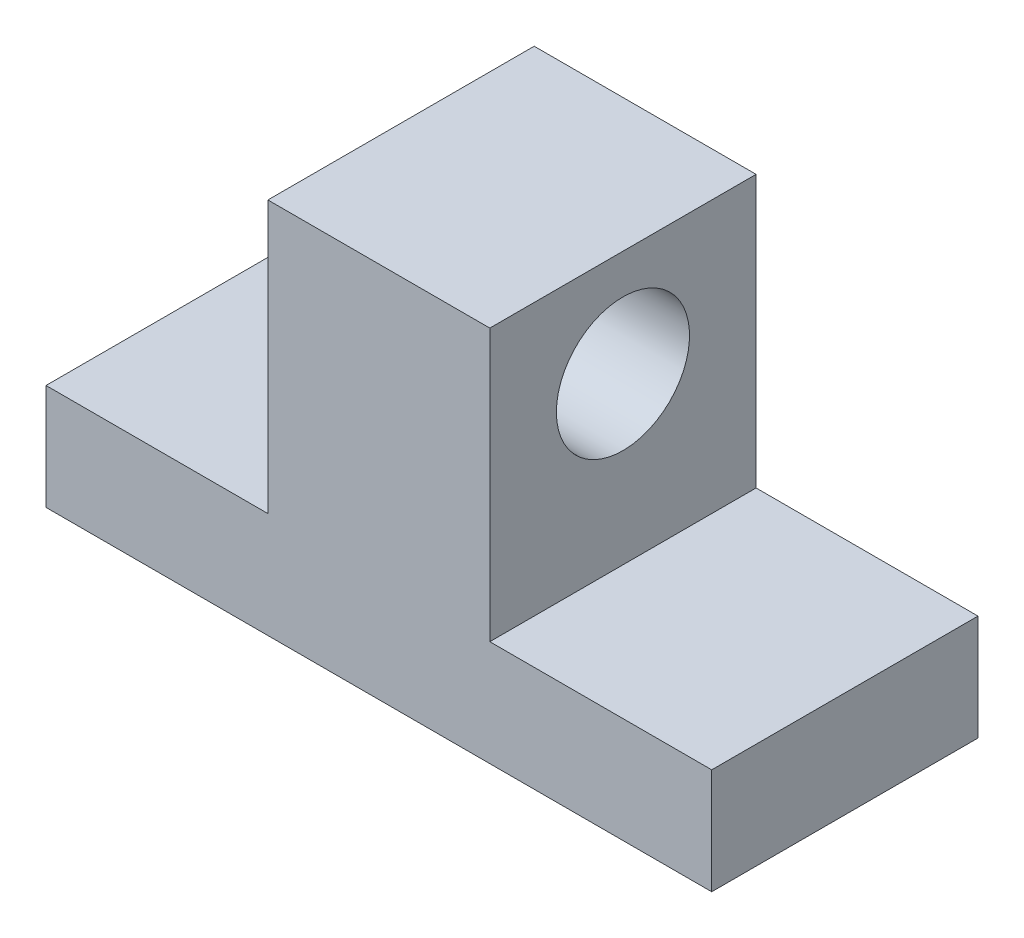
ISO-10303-21;
HEADER;
FILE_DESCRIPTION(('STEP AP214'),'2;1');
FILE_NAME('part.step','',(''),(''),'','','');
FILE_SCHEMA(('AUTOMOTIVE_DESIGN { 1 0 10303 214 1 1 1 1 }'));
ENDSEC;
DATA;
#1=APPLICATION_CONTEXT('core data for automotive mechanical design processes');
#2=APPLICATION_PROTOCOL_DEFINITION('international standard','automotive_design',2000,#1);
#3=PRODUCT_CONTEXT('',#1,'mechanical');
#4=PRODUCT('Part','Part','',(#3));
#5=PRODUCT_RELATED_PRODUCT_CATEGORY('part','',(#4));
#6=PRODUCT_DEFINITION_FORMATION('','',#4);
#7=PRODUCT_DEFINITION_CONTEXT('part definition',#1,'design');
#8=PRODUCT_DEFINITION('design','',#6,#7);
#9=PRODUCT_DEFINITION_SHAPE('','',#8);
#10=(LENGTH_UNIT() NAMED_UNIT(*) SI_UNIT(.MILLI.,.METRE.));
#11=(NAMED_UNIT(*) PLANE_ANGLE_UNIT() SI_UNIT($,.RADIAN.));
#12=(NAMED_UNIT(*) SI_UNIT($,.STERADIAN.) SOLID_ANGLE_UNIT());
#13=UNCERTAINTY_MEASURE_WITH_UNIT(LENGTH_MEASURE(1.E-05),#10,'distance_accuracy_value','');
#14=(GEOMETRIC_REPRESENTATION_CONTEXT(3) GLOBAL_UNCERTAINTY_ASSIGNED_CONTEXT((#13)) GLOBAL_UNIT_ASSIGNED_CONTEXT((#10,
#11,#12)) REPRESENTATION_CONTEXT('',''));
#15=CARTESIAN_POINT('',(0.,0.,0.));
#16=DIRECTION('',(0.,0.,1.));
#17=DIRECTION('',(1.,0.,0.));
#18=AXIS2_PLACEMENT_3D('',#15,#16,#17);
#19=CARTESIAN_POINT('',(0.846446280991737,4.76010881228939,12.));
#20=DIRECTION('',(-1.,0.,0.));
#21=DIRECTION('',(0.,0.,1.));
#22=AXIS2_PLACEMENT_3D('',#19,#20,#21);
#23=PLANE('',#22);
#24=DIRECTION('',(0.,1.,0.));
#25=VECTOR('',#24,1.);
#26=CARTESIAN_POINT('',(0.846446280991737,4.76010881228939,0.));
#27=LINE('',#26,#25);
#28=CARTESIAN_POINT('',(0.846446280991737,0.,0.));
#29=VERTEX_POINT('',#28);
#30=CARTESIAN_POINT('',(0.846446280991737,4.76010881228939,0.));
#31=VERTEX_POINT('',#30);
#32=EDGE_CURVE('E129',#29,#31,#27,.T.);
#33=ORIENTED_EDGE('',*,*,#32,.T.);
#34=DIRECTION('',(0.,0.,-1.));
#35=VECTOR('',#34,1.);
#36=CARTESIAN_POINT('',(0.846446280991737,4.76010881228939,12.));
#37=LINE('',#36,#35);
#38=CARTESIAN_POINT('',(0.846446280991737,4.76010881228939,12.));
#39=VERTEX_POINT('',#38);
#40=EDGE_CURVE('E11',#39,#31,#37,.T.);
#41=ORIENTED_EDGE('',*,*,#40,.F.);
#42=DIRECTION('',(0.,1.,0.));
#43=VECTOR('',#42,1.);
#44=CARTESIAN_POINT('',(0.846446280991737,4.76010881228939,12.));
#45=LINE('',#44,#43);
#46=CARTESIAN_POINT('',(0.846446280991737,0.,12.));
#47=VERTEX_POINT('',#46);
#48=EDGE_CURVE('E144',#47,#39,#45,.T.);
#49=ORIENTED_EDGE('',*,*,#48,.F.);
#50=DIRECTION('',(0.,0.,-1.));
#51=VECTOR('',#50,1.);
#52=CARTESIAN_POINT('',(0.846446280991737,0.,12.));
#53=LINE('',#52,#51);
#54=EDGE_CURVE('E125',#47,#29,#53,.T.);
#55=ORIENTED_EDGE('',*,*,#54,.T.);
#56=EDGE_LOOP('',(#33,#41,#49,#55));
#57=FACE_BOUND('',#56,.T.);
#58=ADVANCED_FACE('F33',(#57),#23,.F.);
#59=CARTESIAN_POINT('',(0.846446280991737,4.76010881228939,12.));
#60=DIRECTION('',(0.,-1.,0.));
#61=DIRECTION('',(0.,0.,-1.));
#62=AXIS2_PLACEMENT_3D('',#59,#60,#61);
#63=PLANE('',#62);
#64=DIRECTION('',(-1.,0.,0.));
#65=VECTOR('',#64,1.);
#66=CARTESIAN_POINT('',(0.846446280991737,4.76010881228939,0.));
#67=LINE('',#66,#65);
#68=CARTESIAN_POINT('',(-9.15355371900826,4.76010881228939,0.));
#69=VERTEX_POINT('',#68);
#70=EDGE_CURVE('E132',#31,#69,#67,.T.);
#71=ORIENTED_EDGE('',*,*,#70,.T.);
#72=DIRECTION('',(0.,0.,-1.));
#73=VECTOR('',#72,1.);
#74=CARTESIAN_POINT('',(-9.15355371900826,4.76010881228939,12.));
#75=LINE('',#74,#73);
#76=CARTESIAN_POINT('',(-9.15355371900826,4.76010881228939,12.));
#77=VERTEX_POINT('',#76);
#78=EDGE_CURVE('E41',#77,#69,#75,.T.);
#79=ORIENTED_EDGE('',*,*,#78,.F.);
#80=DIRECTION('',(-1.,0.,0.));
#81=VECTOR('',#80,1.);
#82=CARTESIAN_POINT('',(0.846446280991737,4.76010881228939,12.));
#83=LINE('',#82,#81);
#84=EDGE_CURVE('E92',#39,#77,#83,.T.);
#85=ORIENTED_EDGE('',*,*,#84,.F.);
#86=ORIENTED_EDGE('',*,*,#40,.T.);
#87=EDGE_LOOP('',(#71,#79,#85,#86));
#88=FACE_BOUND('',#87,.T.);
#89=ADVANCED_FACE('F195',(#88),#63,.F.);
#90=CARTESIAN_POINT('',(-9.15355371900826,4.76010881228939,12.));
#91=DIRECTION('',(-1.,0.,0.));
#92=DIRECTION('',(0.,0.,1.));
#93=AXIS2_PLACEMENT_3D('',#90,#91,#92);
#94=PLANE('',#93);
#95=CARTESIAN_POINT('',(-9.15355371900826,12.2170210392971,6.));
#96=DIRECTION('',(-1.,0.,0.));
#97=DIRECTION('',(0.,0.,1.));
#98=AXIS2_PLACEMENT_3D('',#95,#96,#97);
#99=CIRCLE('',#98,3.);
#100=CARTESIAN_POINT('',(-9.15355371900826,12.2170210392971,9.));
#101=VERTEX_POINT('',#100);
#102=EDGE_CURVE('E133',#101,#101,#99,.T.);
#103=ORIENTED_EDGE('',*,*,#102,.T.);
#104=EDGE_LOOP('',(#103));
#105=FACE_BOUND('',#104,.T.);
#106=DIRECTION('',(0.,1.,0.));
#107=VECTOR('',#106,1.);
#108=CARTESIAN_POINT('',(-9.15355371900826,4.76010881228939,0.));
#109=LINE('',#108,#107);
#110=CARTESIAN_POINT('',(-9.15355371900826,17.,0.));
#111=VERTEX_POINT('',#110);
#112=EDGE_CURVE('E135',#69,#111,#109,.T.);
#113=ORIENTED_EDGE('',*,*,#112,.T.);
#114=DIRECTION('',(0.,0.,-1.));
#115=VECTOR('',#114,1.);
#116=CARTESIAN_POINT('',(-9.15355371900826,17.,12.));
#117=LINE('',#116,#115);
#118=CARTESIAN_POINT('',(-9.15355371900826,17.,12.));
#119=VERTEX_POINT('',#118);
#120=EDGE_CURVE('E151',#119,#111,#117,.T.);
#121=ORIENTED_EDGE('',*,*,#120,.F.);
#122=DIRECTION('',(0.,1.,0.));
#123=VECTOR('',#122,1.);
#124=CARTESIAN_POINT('',(-9.15355371900826,4.76010881228939,12.));
#125=LINE('',#124,#123);
#126=EDGE_CURVE('E159',#77,#119,#125,.T.);
#127=ORIENTED_EDGE('',*,*,#126,.F.);
#128=ORIENTED_EDGE('',*,*,#78,.T.);
#129=EDGE_LOOP('',(#113,#121,#127,#128));
#130=FACE_BOUND('',#129,.T.);
#131=ADVANCED_FACE('F157',(#105,#130),#94,.F.);
#132=CARTESIAN_POINT('',(-19.1535537190083,17.,12.));
#133=DIRECTION('',(0.,-1.,0.));
#134=DIRECTION('',(0.,0.,-1.));
#135=AXIS2_PLACEMENT_3D('',#132,#133,#134);
#136=PLANE('',#135);
#137=DIRECTION('',(-1.,0.,0.));
#138=VECTOR('',#137,1.);
#139=CARTESIAN_POINT('',(-19.1535537190083,17.,0.));
#140=LINE('',#139,#138);
#141=CARTESIAN_POINT('',(-19.1535537190083,17.,0.));
#142=VERTEX_POINT('',#141);
#143=EDGE_CURVE('E137',#111,#142,#140,.T.);
#144=ORIENTED_EDGE('',*,*,#143,.T.);
#145=DIRECTION('',(0.,0.,-1.));
#146=VECTOR('',#145,1.);
#147=CARTESIAN_POINT('',(-19.1535537190083,17.,12.));
#148=LINE('',#147,#146);
#149=CARTESIAN_POINT('',(-19.1535537190083,17.,12.));
#150=VERTEX_POINT('',#149);
#151=EDGE_CURVE('E148',#150,#142,#148,.T.);
#152=ORIENTED_EDGE('',*,*,#151,.F.);
#153=DIRECTION('',(-1.,0.,0.));
#154=VECTOR('',#153,1.);
#155=CARTESIAN_POINT('',(-19.1535537190083,17.,12.));
#156=LINE('',#155,#154);
#157=EDGE_CURVE('E171',#119,#150,#156,.T.);
#158=ORIENTED_EDGE('',*,*,#157,.F.);
#159=ORIENTED_EDGE('',*,*,#120,.T.);
#160=EDGE_LOOP('',(#144,#152,#158,#159));
#161=FACE_BOUND('',#160,.T.);
#162=ADVANCED_FACE('F167',(#161),#136,.F.);
#163=CARTESIAN_POINT('',(-19.1535537190083,4.76010881228939,12.));
#164=DIRECTION('',(1.,0.,0.));
#165=DIRECTION('',(0.,0.,-1.));
#166=AXIS2_PLACEMENT_3D('',#163,#164,#165);
#167=PLANE('',#166);
#168=CARTESIAN_POINT('',(-19.1535537190083,12.2170210392971,6.));
#169=DIRECTION('',(-1.,0.,0.));
#170=DIRECTION('',(0.,0.,1.));
#171=AXIS2_PLACEMENT_3D('',#168,#169,#170);
#172=CIRCLE('',#171,3.);
#173=CARTESIAN_POINT('',(-19.1535537190083,12.2170210392971,9.));
#174=VERTEX_POINT('',#173);
#175=EDGE_CURVE('E179',#174,#174,#172,.T.);
#176=ORIENTED_EDGE('',*,*,#175,.F.);
#177=EDGE_LOOP('',(#176));
#178=FACE_BOUND('',#177,.T.);
#179=DIRECTION('',(0.,-1.,0.));
#180=VECTOR('',#179,1.);
#181=CARTESIAN_POINT('',(-19.1535537190083,4.76010881228939,0.));
#182=LINE('',#181,#180);
#183=CARTESIAN_POINT('',(-19.1535537190083,4.76010881228939,0.));
#184=VERTEX_POINT('',#183);
#185=EDGE_CURVE('E139',#142,#184,#182,.T.);
#186=ORIENTED_EDGE('',*,*,#185,.T.);
#187=DIRECTION('',(0.,0.,-1.));
#188=VECTOR('',#187,1.);
#189=CARTESIAN_POINT('',(-19.1535537190083,4.76010881228939,12.));
#190=LINE('',#189,#188);
#191=CARTESIAN_POINT('',(-19.1535537190083,4.76010881228939,12.));
#192=VERTEX_POINT('',#191);
#193=EDGE_CURVE('E120',#192,#184,#190,.T.);
#194=ORIENTED_EDGE('',*,*,#193,.F.);
#195=DIRECTION('',(0.,-1.,0.));
#196=VECTOR('',#195,1.);
#197=CARTESIAN_POINT('',(-19.1535537190083,4.76010881228939,12.));
#198=LINE('',#197,#196);
#199=EDGE_CURVE('E111',#150,#192,#198,.T.);
#200=ORIENTED_EDGE('',*,*,#199,.F.);
#201=ORIENTED_EDGE('',*,*,#151,.T.);
#202=EDGE_LOOP('',(#186,#194,#200,#201));
#203=FACE_BOUND('',#202,.T.);
#204=ADVANCED_FACE('F170',(#178,#203),#167,.F.);
#205=CARTESIAN_POINT('',(-29.1535537190083,4.76010881228939,12.));
#206=DIRECTION('',(0.,-1.,0.));
#207=DIRECTION('',(0.,0.,-1.));
#208=AXIS2_PLACEMENT_3D('',#205,#206,#207);
#209=PLANE('',#208);
#210=DIRECTION('',(-1.,0.,0.));
#211=VECTOR('',#210,1.);
#212=CARTESIAN_POINT('',(-29.1535537190083,4.76010881228939,0.));
#213=LINE('',#212,#211);
#214=CARTESIAN_POINT('',(-29.1535537190083,4.76010881228939,0.));
#215=VERTEX_POINT('',#214);
#216=EDGE_CURVE('E119',#184,#215,#213,.T.);
#217=ORIENTED_EDGE('',*,*,#216,.T.);
#218=DIRECTION('',(0.,0.,-1.));
#219=VECTOR('',#218,1.);
#220=CARTESIAN_POINT('',(-29.1535537190083,4.76010881228939,12.));
#221=LINE('',#220,#219);
#222=CARTESIAN_POINT('',(-29.1535537190083,4.76010881228939,12.));
#223=VERTEX_POINT('',#222);
#224=EDGE_CURVE('E116',#223,#215,#221,.T.);
#225=ORIENTED_EDGE('',*,*,#224,.F.);
#226=DIRECTION('',(-1.,0.,0.));
#227=VECTOR('',#226,1.);
#228=CARTESIAN_POINT('',(-29.1535537190083,4.76010881228939,12.));
#229=LINE('',#228,#227);
#230=EDGE_CURVE('E105',#192,#223,#229,.T.);
#231=ORIENTED_EDGE('',*,*,#230,.F.);
#232=ORIENTED_EDGE('',*,*,#193,.T.);
#233=EDGE_LOOP('',(#217,#225,#231,#232));
#234=FACE_BOUND('',#233,.T.);
#235=ADVANCED_FACE('F117',(#234),#209,.F.);
#236=CARTESIAN_POINT('',(-29.1535537190083,4.76010881228939,12.));
#237=DIRECTION('',(1.,0.,0.));
#238=DIRECTION('',(0.,0.,-1.));
#239=AXIS2_PLACEMENT_3D('',#236,#237,#238);
#240=PLANE('',#239);
#241=DIRECTION('',(0.,-1.,0.));
#242=VECTOR('',#241,1.);
#243=CARTESIAN_POINT('',(-29.1535537190083,4.76010881228939,0.));
#244=LINE('',#243,#242);
#245=CARTESIAN_POINT('',(-29.1535537190083,0.,0.));
#246=VERTEX_POINT('',#245);
#247=EDGE_CURVE('E78',#215,#246,#244,.T.);
#248=ORIENTED_EDGE('',*,*,#247,.T.);
#249=DIRECTION('',(0.,0.,-1.));
#250=VECTOR('',#249,1.);
#251=CARTESIAN_POINT('',(-29.1535537190083,0.,12.));
#252=LINE('',#251,#250);
#253=CARTESIAN_POINT('',(-29.1535537190083,0.,12.));
#254=VERTEX_POINT('',#253);
#255=EDGE_CURVE('E121',#254,#246,#252,.T.);
#256=ORIENTED_EDGE('',*,*,#255,.F.);
#257=DIRECTION('',(0.,-1.,0.));
#258=VECTOR('',#257,1.);
#259=CARTESIAN_POINT('',(-29.1535537190083,4.76010881228939,12.));
#260=LINE('',#259,#258);
#261=EDGE_CURVE('E109',#223,#254,#260,.T.);
#262=ORIENTED_EDGE('',*,*,#261,.F.);
#263=ORIENTED_EDGE('',*,*,#224,.T.);
#264=EDGE_LOOP('',(#248,#256,#262,#263));
#265=FACE_BOUND('',#264,.T.);
#266=ADVANCED_FACE('F123',(#265),#240,.F.);
#267=CARTESIAN_POINT('',(0.846446280991737,0.,12.));
#268=DIRECTION('',(0.,1.,0.));
#269=DIRECTION('',(-1.,0.,0.));
#270=AXIS2_PLACEMENT_3D('',#267,#268,#269);
#271=PLANE('',#270);
#272=DIRECTION('',(1.,0.,0.));
#273=VECTOR('',#272,1.);
#274=CARTESIAN_POINT('',(0.846446280991737,0.,0.));
#275=LINE('',#274,#273);
#276=EDGE_CURVE('E84',#246,#29,#275,.T.);
#277=ORIENTED_EDGE('',*,*,#276,.T.);
#278=ORIENTED_EDGE('',*,*,#54,.F.);
#279=DIRECTION('',(1.,0.,0.));
#280=VECTOR('',#279,1.);
#281=CARTESIAN_POINT('',(0.846446280991737,0.,12.));
#282=LINE('',#281,#280);
#283=EDGE_CURVE('E49',#254,#47,#282,.T.);
#284=ORIENTED_EDGE('',*,*,#283,.F.);
#285=ORIENTED_EDGE('',*,*,#255,.T.);
#286=EDGE_LOOP('',(#277,#278,#284,#285));
#287=FACE_BOUND('',#286,.T.);
#288=ADVANCED_FACE('F202',(#287),#271,.F.);
#289=CARTESIAN_POINT('',(0.846446280991737,0.,12.));
#290=DIRECTION('',(0.,0.,-1.));
#291=DIRECTION('',(-1.,0.,0.));
#292=AXIS2_PLACEMENT_3D('',#289,#290,#291);
#293=PLANE('',#292);
#294=ORIENTED_EDGE('',*,*,#48,.T.);
#295=ORIENTED_EDGE('',*,*,#84,.T.);
#296=ORIENTED_EDGE('',*,*,#126,.T.);
#297=ORIENTED_EDGE('',*,*,#157,.T.);
#298=ORIENTED_EDGE('',*,*,#199,.T.);
#299=ORIENTED_EDGE('',*,*,#230,.T.);
#300=ORIENTED_EDGE('',*,*,#261,.T.);
#301=ORIENTED_EDGE('',*,*,#283,.T.);
#302=EDGE_LOOP('',(#294,#295,#296,#297,#298,#299,#300,#301));
#303=FACE_BOUND('',#302,.T.);
#304=ADVANCED_FACE('F107',(#303),#293,.F.);
#305=CARTESIAN_POINT('',(0.846446280991737,0.,0.));
#306=DIRECTION('',(0.,0.,-1.));
#307=DIRECTION('',(-1.,0.,0.));
#308=AXIS2_PLACEMENT_3D('',#305,#306,#307);
#309=PLANE('',#308);
#310=ORIENTED_EDGE('',*,*,#32,.F.);
#311=ORIENTED_EDGE('',*,*,#276,.F.);
#312=ORIENTED_EDGE('',*,*,#247,.F.);
#313=ORIENTED_EDGE('',*,*,#216,.F.);
#314=ORIENTED_EDGE('',*,*,#185,.F.);
#315=ORIENTED_EDGE('',*,*,#143,.F.);
#316=ORIENTED_EDGE('',*,*,#112,.F.);
#317=ORIENTED_EDGE('',*,*,#70,.F.);
#318=EDGE_LOOP('',(#310,#311,#312,#313,#314,#315,#316,#317));
#319=FACE_BOUND('',#318,.T.);
#320=ADVANCED_FACE('F163',(#319),#309,.T.);
#321=CARTESIAN_POINT('',(0.846446280991737,12.2170210392971,6.));
#322=DIRECTION('',(-1.,0.,0.));
#323=DIRECTION('',(0.,0.,1.));
#324=AXIS2_PLACEMENT_3D('',#321,#322,#323);
#325=CYLINDRICAL_SURFACE('',#324,3.);
#326=ORIENTED_EDGE('',*,*,#175,.T.);
#327=EDGE_LOOP('',(#326));
#328=FACE_BOUND('',#327,.T.);
#329=ORIENTED_EDGE('',*,*,#102,.F.);
#330=EDGE_LOOP('',(#329));
#331=FACE_BOUND('',#330,.T.);
#332=ADVANCED_FACE('F183',(#328,#331),#325,.F.);
#333=CLOSED_SHELL('',(#58,#89,#131,#162,#204,#235,#266,#288,#304,#320,#332));
#334=MANIFOLD_SOLID_BREP('B2',#333);
#335=ADVANCED_BREP_SHAPE_REPRESENTATION('',(#18,#334),#14);
#336=SHAPE_DEFINITION_REPRESENTATION(#9,#335);
ENDSEC;
END-ISO-10303-21;
